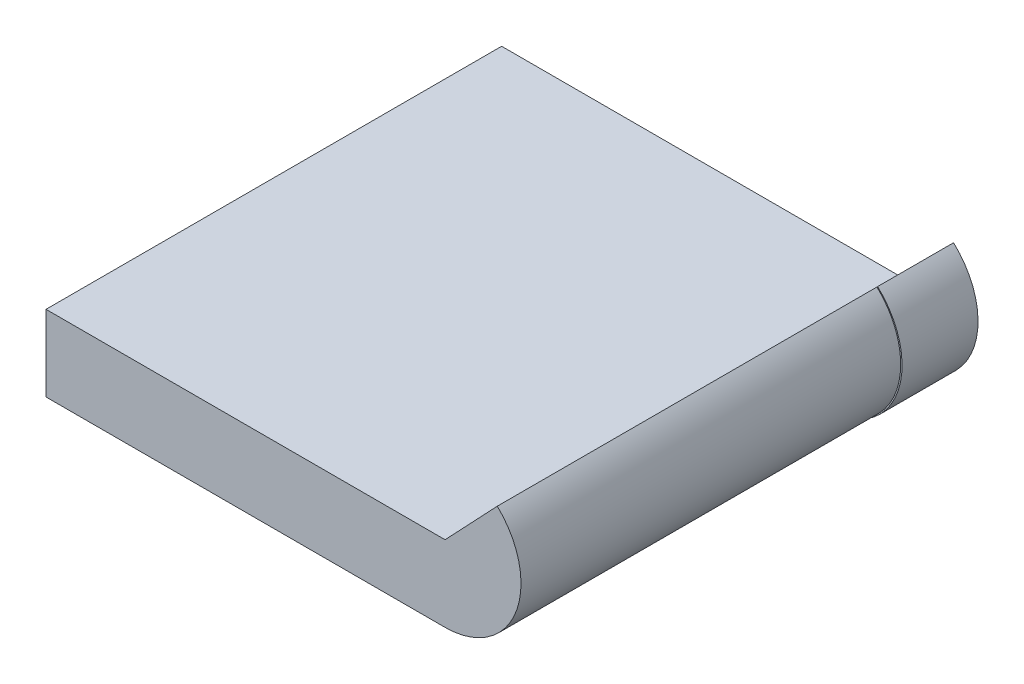
ISO-10303-21;
HEADER;
FILE_DESCRIPTION(('STEP AP214'),'2;1');
FILE_NAME('part.step','',(''),(''),'','','');
FILE_SCHEMA(('AUTOMOTIVE_DESIGN { 1 0 10303 214 1 1 1 1 }'));
ENDSEC;
DATA;
#1=APPLICATION_CONTEXT('core data for automotive mechanical design processes');
#2=APPLICATION_PROTOCOL_DEFINITION('international standard','automotive_design',2000,#1);
#3=PRODUCT_CONTEXT('',#1,'mechanical');
#4=PRODUCT('Part','Part','',(#3));
#5=PRODUCT_RELATED_PRODUCT_CATEGORY('part','',(#4));
#6=PRODUCT_DEFINITION_FORMATION('','',#4);
#7=PRODUCT_DEFINITION_CONTEXT('part definition',#1,'design');
#8=PRODUCT_DEFINITION('design','',#6,#7);
#9=PRODUCT_DEFINITION_SHAPE('','',#8);
#10=(LENGTH_UNIT() NAMED_UNIT(*) SI_UNIT(.MILLI.,.METRE.));
#11=(NAMED_UNIT(*) PLANE_ANGLE_UNIT() SI_UNIT($,.RADIAN.));
#12=(NAMED_UNIT(*) SI_UNIT($,.STERADIAN.) SOLID_ANGLE_UNIT());
#13=UNCERTAINTY_MEASURE_WITH_UNIT(LENGTH_MEASURE(1.E-05),#10,'distance_accuracy_value','');
#14=(GEOMETRIC_REPRESENTATION_CONTEXT(3) GLOBAL_UNCERTAINTY_ASSIGNED_CONTEXT((#13)) GLOBAL_UNIT_ASSIGNED_CONTEXT((#10,
#11,#12)) REPRESENTATION_CONTEXT('',''));
#15=CARTESIAN_POINT('',(0.,0.,0.));
#16=DIRECTION('',(0.,0.,1.));
#17=DIRECTION('',(1.,0.,0.));
#18=AXIS2_PLACEMENT_3D('',#15,#16,#17);
#19=CARTESIAN_POINT('',(-116.140375406953,22.8853755359338,18.));
#20=DIRECTION('',(0.,0.,-1.));
#21=DIRECTION('',(-1.,0.,0.));
#22=AXIS2_PLACEMENT_3D('',#19,#20,#21);
#23=PLANE('',#22);
#24=CARTESIAN_POINT('',(9.44561548698255,22.8853755359338,18.));
#25=DIRECTION('',(0.,0.,1.));
#26=DIRECTION('',(1.,0.,0.));
#27=AXIS2_PLACEMENT_3D('',#24,#25,#26);
#28=CIRCLE('',#27,3.);
#29=CARTESIAN_POINT('',(9.44561548698247,19.8853755359338,18.));
#30=VERTEX_POINT('',#29);
#31=CARTESIAN_POINT('',(11.5082121247797,25.0638371742804,18.));
#32=VERTEX_POINT('',#31);
#33=EDGE_CURVE('E1713',#30,#32,#28,.T.);
#34=ORIENTED_EDGE('',*,*,#33,.T.);
#35=DIRECTION('',(-0.687532212599054,-0.726153879448873,0.));
#36=VECTOR('',#35,1.);
#37=CARTESIAN_POINT('',(-49.9189506471543,-39.8139557974211,18.));
#38=LINE('',#37,#36);
#39=CARTESIAN_POINT('',(9.44561548698256,22.8853755359338,18.));
#40=VERTEX_POINT('',#39);
#41=EDGE_CURVE('E1659',#32,#40,#38,.T.);
#42=ORIENTED_EDGE('',*,*,#41,.T.);
#43=DIRECTION('',(1.,0.,0.));
#44=VECTOR('',#43,1.);
#45=CARTESIAN_POINT('',(9.44561548698255,22.8853755359338,18.));
#46=LINE('',#45,#44);
#47=CARTESIAN_POINT('',(-6.31999999999992,22.8853755359338,18.));
#48=VERTEX_POINT('',#47);
#49=EDGE_CURVE('E1731',#48,#40,#46,.T.);
#50=ORIENTED_EDGE('',*,*,#49,.F.);
#51=DIRECTION('',(0.,1.,0.));
#52=VECTOR('',#51,1.);
#53=CARTESIAN_POINT('',(-6.31999999999992,22.8853755359338,18.));
#54=LINE('',#53,#52);
#55=CARTESIAN_POINT('',(-6.31999999999994,19.8853755359338,18.));
#56=VERTEX_POINT('',#55);
#57=EDGE_CURVE('E1715',#56,#48,#54,.T.);
#58=ORIENTED_EDGE('',*,*,#57,.F.);
#59=DIRECTION('',(1.,0.,0.));
#60=VECTOR('',#59,1.);
#61=CARTESIAN_POINT('',(-3.31999999999992,19.8853755359338,18.));
#62=LINE('',#61,#60);
#63=EDGE_CURVE('E1699',#56,#30,#62,.T.);
#64=ORIENTED_EDGE('',*,*,#63,.T.);
#65=EDGE_LOOP('',(#34,#42,#50,#58,#64));
#66=FACE_BOUND('',#65,.T.);
#67=ADVANCED_FACE('F1642',(#66),#23,.F.);
#68=CARTESIAN_POINT('',(17.1800000000001,19.8853755359338,3.));
#69=DIRECTION('',(0.,1.,0.));
#70=DIRECTION('',(1.,0.,0.));
#71=AXIS2_PLACEMENT_3D('',#68,#69,#70);
#72=PLANE('',#71);
#73=DIRECTION('',(1.,0.,0.));
#74=VECTOR('',#73,1.);
#75=CARTESIAN_POINT('',(-336.32,19.8853755359338,0.));
#76=LINE('',#75,#74);
#77=CARTESIAN_POINT('',(-6.31999999999994,19.8853755359338,0.));
#78=VERTEX_POINT('',#77);
#79=CARTESIAN_POINT('',(9.50037540695259,19.8853755359338,0.));
#80=VERTEX_POINT('',#79);
#81=EDGE_CURVE('E1645',#78,#80,#76,.T.);
#82=ORIENTED_EDGE('',*,*,#81,.T.);
#83=DIRECTION('',(0.,0.,-1.));
#84=VECTOR('',#83,1.);
#85=CARTESIAN_POINT('',(9.5003754069526,19.8853755359338,3.));
#86=LINE('',#85,#84);
#87=CARTESIAN_POINT('',(9.5003754069526,19.8853755359338,3.));
#88=VERTEX_POINT('',#87);
#89=EDGE_CURVE('E1704',#88,#80,#86,.T.);
#90=ORIENTED_EDGE('',*,*,#89,.F.);
#91=DIRECTION('',(-1.,0.,0.));
#92=VECTOR('',#91,1.);
#93=CARTESIAN_POINT('',(17.1800000000001,19.8853755359338,3.));
#94=LINE('',#93,#92);
#95=CARTESIAN_POINT('',(9.44561548698247,19.8853755359338,3.));
#96=VERTEX_POINT('',#95);
#97=EDGE_CURVE('E1720',#88,#96,#94,.T.);
#98=ORIENTED_EDGE('',*,*,#97,.T.);
#99=DIRECTION('',(0.,0.,-1.));
#100=VECTOR('',#99,1.);
#101=CARTESIAN_POINT('',(9.44561548698247,19.8853755359338,18.));
#102=LINE('',#101,#100);
#103=EDGE_CURVE('E1717',#30,#96,#102,.T.);
#104=ORIENTED_EDGE('',*,*,#103,.F.);
#105=ORIENTED_EDGE('',*,*,#63,.F.);
#106=DIRECTION('',(0.,0.,-1.));
#107=VECTOR('',#106,1.);
#108=CARTESIAN_POINT('',(-6.31999999999994,19.8853755359338,-18.87));
#109=LINE('',#108,#107);
#110=EDGE_CURVE('E1694',#56,#78,#109,.T.);
#111=ORIENTED_EDGE('',*,*,#110,.T.);
#112=EDGE_LOOP('',(#82,#90,#98,#104,#105,#111));
#113=FACE_BOUND('',#112,.T.);
#114=ADVANCED_FACE('F1718',(#113),#72,.F.);
#115=CARTESIAN_POINT('',(-6.31999999999999,22.8853755359338,-18.87));
#116=DIRECTION('',(1.,0.,0.));
#117=DIRECTION('',(0.,-1.,0.));
#118=AXIS2_PLACEMENT_3D('',#115,#116,#117);
#119=PLANE('',#118);
#120=DIRECTION('',(0.,1.,0.));
#121=VECTOR('',#120,1.);
#122=CARTESIAN_POINT('',(-6.31999999999999,22.8853755359338,0.));
#123=LINE('',#122,#121);
#124=CARTESIAN_POINT('',(-6.31999999999998,22.8853755359338,0.));
#125=VERTEX_POINT('',#124);
#126=EDGE_CURVE('E1739',#78,#125,#123,.T.);
#127=ORIENTED_EDGE('',*,*,#126,.F.);
#128=ORIENTED_EDGE('',*,*,#110,.F.);
#129=ORIENTED_EDGE('',*,*,#57,.T.);
#130=DIRECTION('',(0.,0.,1.));
#131=VECTOR('',#130,1.);
#132=CARTESIAN_POINT('',(-6.31999999999999,22.8853755359338,-18.87));
#133=LINE('',#132,#131);
#134=EDGE_CURVE('E1734',#125,#48,#133,.T.);
#135=ORIENTED_EDGE('',*,*,#134,.F.);
#136=EDGE_LOOP('',(#127,#128,#129,#135));
#137=FACE_BOUND('',#136,.T.);
#138=ADVANCED_FACE('F1769',(#137),#119,.F.);
#139=CARTESIAN_POINT('',(-6.31999999999999,22.8853755359338,-18.87));
#140=DIRECTION('',(0.,1.,0.));
#141=DIRECTION('',(0.,0.,1.));
#142=AXIS2_PLACEMENT_3D('',#139,#140,#141);
#143=PLANE('',#142);
#144=DIRECTION('',(1.,0.,0.));
#145=VECTOR('',#144,1.);
#146=CARTESIAN_POINT('',(-3.28743401700218,22.8853755359338,0.));
#147=LINE('',#146,#145);
#148=CARTESIAN_POINT('',(9.44561548698256,22.8853755359338,0.));
#149=VERTEX_POINT('',#148);
#150=EDGE_CURVE('E1736',#125,#149,#147,.T.);
#151=ORIENTED_EDGE('',*,*,#150,.F.);
#152=ORIENTED_EDGE('',*,*,#134,.T.);
#153=ORIENTED_EDGE('',*,*,#49,.T.);
#154=DIRECTION('',(0.,0.,1.));
#155=VECTOR('',#154,1.);
#156=CARTESIAN_POINT('',(9.44561548698255,22.8853755359338,0.));
#157=LINE('',#156,#155);
#158=EDGE_CURVE('E13',#149,#40,#157,.T.);
#159=ORIENTED_EDGE('',*,*,#158,.F.);
#160=EDGE_LOOP('',(#151,#152,#153,#159));
#161=FACE_BOUND('',#160,.T.);
#162=ADVANCED_FACE('F1761',(#161),#143,.T.);
#163=CARTESIAN_POINT('',(0.,0.,3.));
#164=DIRECTION('',(0.,0.,-1.));
#165=DIRECTION('',(-1.,0.,0.));
#166=AXIS2_PLACEMENT_3D('',#163,#164,#165);
#167=PLANE('',#166);
#168=CARTESIAN_POINT('',(9.5003754069526,22.8853755359338,3.));
#169=DIRECTION('',(0.,0.,1.));
#170=DIRECTION('',(1.,0.,0.));
#171=AXIS2_PLACEMENT_3D('',#168,#169,#170);
#172=CIRCLE('',#171,3.);
#173=CARTESIAN_POINT('',(11.533915974705,25.0909849209576,3.));
#174=VERTEX_POINT('',#173);
#175=EDGE_CURVE('E1738',#174,#88,#172,.F.);
#176=ORIENTED_EDGE('',*,*,#175,.F.);
#177=DIRECTION('',(-0.687532212599054,-0.726153879448873,0.));
#178=VECTOR('',#177,1.);
#179=CARTESIAN_POINT('',(-6.44495156166062,6.10216640396568,3.));
#180=LINE('',#179,#178);
#181=CARTESIAN_POINT('',(11.5082121247797,25.0638371742804,3.));
#182=VERTEX_POINT('',#181);
#183=EDGE_CURVE('E1673',#174,#182,#180,.T.);
#184=ORIENTED_EDGE('',*,*,#183,.T.);
#185=CARTESIAN_POINT('',(9.44561548698255,22.8853755359338,3.));
#186=DIRECTION('',(0.,0.,1.));
#187=DIRECTION('',(1.,0.,0.));
#188=AXIS2_PLACEMENT_3D('',#185,#186,#187);
#189=CIRCLE('',#188,3.);
#190=EDGE_CURVE('E1744',#96,#182,#189,.T.);
#191=ORIENTED_EDGE('',*,*,#190,.F.);
#192=ORIENTED_EDGE('',*,*,#97,.F.);
#193=EDGE_LOOP('',(#176,#184,#191,#192));
#194=FACE_BOUND('',#193,.T.);
#195=ADVANCED_FACE('F1758',(#194),#167,.F.);
#196=CARTESIAN_POINT('',(0.,0.,0.));
#197=DIRECTION('',(0.,0.,-1.));
#198=DIRECTION('',(-1.,0.,0.));
#199=AXIS2_PLACEMENT_3D('',#196,#197,#198);
#200=PLANE('',#199);
#201=DIRECTION('',(-0.687532212599054,-0.726153879448873,0.));
#202=VECTOR('',#201,1.);
#203=CARTESIAN_POINT('',(11.533915974705,25.0909849209576,0.));
#204=LINE('',#203,#202);
#205=CARTESIAN_POINT('',(11.533915974705,25.0909849209576,0.));
#206=VERTEX_POINT('',#205);
#207=EDGE_CURVE('E1651',#206,#149,#204,.T.);
#208=ORIENTED_EDGE('',*,*,#207,.F.);
#209=CARTESIAN_POINT('',(9.5003754069526,22.8853755359338,0.));
#210=DIRECTION('',(0.,0.,1.));
#211=DIRECTION('',(1.,0.,0.));
#212=AXIS2_PLACEMENT_3D('',#209,#210,#211);
#213=CIRCLE('',#212,3.);
#214=EDGE_CURVE('E1745',#80,#206,#213,.T.);
#215=ORIENTED_EDGE('',*,*,#214,.F.);
#216=ORIENTED_EDGE('',*,*,#81,.F.);
#217=ORIENTED_EDGE('',*,*,#126,.T.);
#218=ORIENTED_EDGE('',*,*,#150,.T.);
#219=EDGE_LOOP('',(#208,#215,#216,#217,#218));
#220=FACE_BOUND('',#219,.T.);
#221=ADVANCED_FACE('F1760',(#220),#200,.T.);
#222=CARTESIAN_POINT('',(9.5003754069526,22.8853755359338,3.));
#223=DIRECTION('',(0.,0.,-1.));
#224=DIRECTION('',(1.,0.,0.));
#225=AXIS2_PLACEMENT_3D('',#222,#223,#224);
#226=CYLINDRICAL_SURFACE('',#225,3.);
#227=ORIENTED_EDGE('',*,*,#175,.T.);
#228=ORIENTED_EDGE('',*,*,#89,.T.);
#229=ORIENTED_EDGE('',*,*,#214,.T.);
#230=DIRECTION('',(0.,0.,-1.));
#231=VECTOR('',#230,1.);
#232=CARTESIAN_POINT('',(11.533915974705,25.0909849209576,3.));
#233=LINE('',#232,#231);
#234=EDGE_CURVE('E1676',#206,#174,#233,.F.);
#235=ORIENTED_EDGE('',*,*,#234,.T.);
#236=EDGE_LOOP('',(#227,#228,#229,#235));
#237=FACE_BOUND('',#236,.T.);
#238=ADVANCED_FACE('F1756',(#237),#226,.T.);
#239=CARTESIAN_POINT('',(9.44561548698255,22.8853755359338,18.));
#240=DIRECTION('',(0.,0.,-1.));
#241=DIRECTION('',(-1.,0.,0.));
#242=AXIS2_PLACEMENT_3D('',#239,#240,#241);
#243=CYLINDRICAL_SURFACE('',#242,3.);
#244=ORIENTED_EDGE('',*,*,#190,.T.);
#245=DIRECTION('',(0.,0.,-1.));
#246=VECTOR('',#245,1.);
#247=CARTESIAN_POINT('',(11.5082121247797,25.0638371742804,18.));
#248=LINE('',#247,#246);
#249=EDGE_CURVE('E1724',#182,#32,#248,.F.);
#250=ORIENTED_EDGE('',*,*,#249,.T.);
#251=ORIENTED_EDGE('',*,*,#33,.F.);
#252=ORIENTED_EDGE('',*,*,#103,.T.);
#253=EDGE_LOOP('',(#244,#250,#251,#252));
#254=FACE_BOUND('',#253,.T.);
#255=ADVANCED_FACE('F1726',(#254),#243,.T.);
#256=CARTESIAN_POINT('',(11.533915974705,25.0909849209576,263.));
#257=DIRECTION('',(0.726153879448873,-0.687532212599054,0.));
#258=DIRECTION('',(0.687532212599054,0.726153879448873,0.));
#259=AXIS2_PLACEMENT_3D('',#256,#257,#258);
#260=PLANE('',#259);
#261=ORIENTED_EDGE('',*,*,#249,.F.);
#262=ORIENTED_EDGE('',*,*,#183,.F.);
#263=ORIENTED_EDGE('',*,*,#234,.F.);
#264=ORIENTED_EDGE('',*,*,#207,.T.);
#265=ORIENTED_EDGE('',*,*,#158,.T.);
#266=ORIENTED_EDGE('',*,*,#41,.F.);
#267=EDGE_LOOP('',(#261,#262,#263,#264,#265,#266));
#268=FACE_BOUND('',#267,.T.);
#269=ADVANCED_FACE('F1787',(#268),#260,.F.);
#270=CLOSED_SHELL('',(#67,#114,#138,#162,#195,#221,#238,#255,#269));
#271=MANIFOLD_SOLID_BREP('B2',#270);
#272=ADVANCED_BREP_SHAPE_REPRESENTATION('',(#18,#271),#14);
#273=SHAPE_DEFINITION_REPRESENTATION(#9,#272);
ENDSEC;
END-ISO-10303-21;
